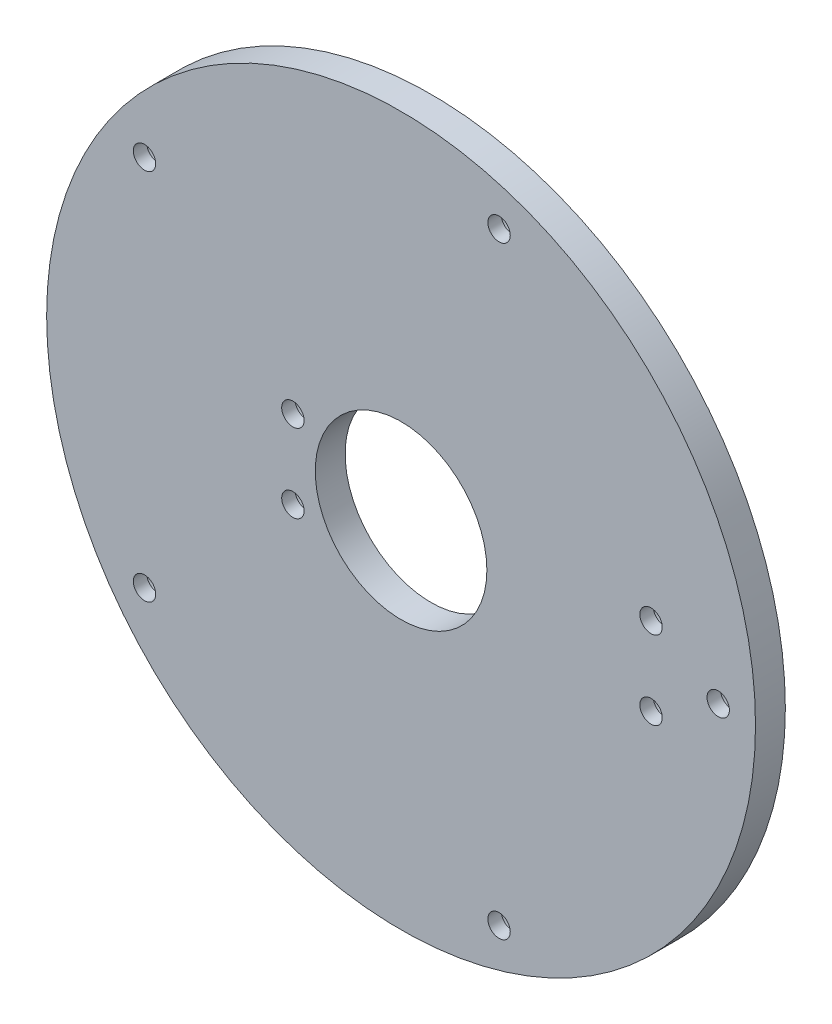
ISO-10303-21;
HEADER;
FILE_DESCRIPTION(('STEP AP214'),'2;1');
FILE_NAME('part.step','',(''),(''),'','','');
FILE_SCHEMA(('AUTOMOTIVE_DESIGN { 1 0 10303 214 1 1 1 1 }'));
ENDSEC;
DATA;
#1=APPLICATION_CONTEXT('core data for automotive mechanical design processes');
#2=APPLICATION_PROTOCOL_DEFINITION('international standard','automotive_design',2000,#1);
#3=PRODUCT_CONTEXT('',#1,'mechanical');
#4=PRODUCT('Part','Part','',(#3));
#5=PRODUCT_RELATED_PRODUCT_CATEGORY('part','',(#4));
#6=PRODUCT_DEFINITION_FORMATION('','',#4);
#7=PRODUCT_DEFINITION_CONTEXT('part definition',#1,'design');
#8=PRODUCT_DEFINITION('design','',#6,#7);
#9=PRODUCT_DEFINITION_SHAPE('','',#8);
#10=(LENGTH_UNIT() NAMED_UNIT(*) SI_UNIT(.MILLI.,.METRE.));
#11=(NAMED_UNIT(*) PLANE_ANGLE_UNIT() SI_UNIT($,.RADIAN.));
#12=(NAMED_UNIT(*) SI_UNIT($,.STERADIAN.) SOLID_ANGLE_UNIT());
#13=UNCERTAINTY_MEASURE_WITH_UNIT(LENGTH_MEASURE(1.E-05),#10,'distance_accuracy_value','');
#14=(GEOMETRIC_REPRESENTATION_CONTEXT(3) GLOBAL_UNCERTAINTY_ASSIGNED_CONTEXT((#13)) GLOBAL_UNIT_ASSIGNED_CONTEXT((#10,
#11,#12)) REPRESENTATION_CONTEXT('',''));
#15=CARTESIAN_POINT('',(0.,0.,0.));
#16=DIRECTION('',(0.,0.,1.));
#17=DIRECTION('',(1.,0.,0.));
#18=AXIS2_PLACEMENT_3D('',#15,#16,#17);
#19=CARTESIAN_POINT('',(47.5,-57.1414213562373,0.));
#20=DIRECTION('',(0.,0.,1.));
#21=DIRECTION('',(1.,0.,0.));
#22=AXIS2_PLACEMENT_3D('',#19,#20,#21);
#23=PLANE('',#22);
#24=CARTESIAN_POINT('',(81.0000000000001,42.125,0.));
#25=DIRECTION('',(0.,0.,1.));
#26=DIRECTION('',(1.,0.,0.));
#27=AXIS2_PLACEMENT_3D('',#24,#25,#26);
#28=CIRCLE('',#27,2.75);
#29=CARTESIAN_POINT('',(83.7500000000001,42.125,0.));
#30=VERTEX_POINT('',#29);
#31=EDGE_CURVE('E184',#30,#30,#28,.T.);
#32=ORIENTED_EDGE('',*,*,#31,.T.);
#33=EDGE_LOOP('',(#32));
#34=FACE_BOUND('',#33,.T.);
#35=CARTESIAN_POINT('',(81.0000000000001,52.625,0.));
#36=DIRECTION('',(0.,0.,1.));
#37=DIRECTION('',(1.,0.,0.));
#38=AXIS2_PLACEMENT_3D('',#35,#36,#37);
#39=CIRCLE('',#38,2.75);
#40=CARTESIAN_POINT('',(83.7500000000001,52.625,0.));
#41=VERTEX_POINT('',#40);
#42=EDGE_CURVE('E195',#41,#41,#39,.T.);
#43=ORIENTED_EDGE('',*,*,#42,.T.);
#44=EDGE_LOOP('',(#43));
#45=FACE_BOUND('',#44,.T.);
#46=CARTESIAN_POINT('',(13.1167777390647,72.4808732224301,0.));
#47=DIRECTION('',(0.,0.,1.));
#48=DIRECTION('',(1.,0.,0.));
#49=AXIS2_PLACEMENT_3D('',#46,#47,#48);
#50=CIRCLE('',#49,2.75);
#51=CARTESIAN_POINT('',(15.8667777390647,72.4808732224301,0.));
#52=VERTEX_POINT('',#51);
#53=EDGE_CURVE('E211',#52,#52,#50,.T.);
#54=ORIENTED_EDGE('',*,*,#53,.T.);
#55=EDGE_LOOP('',(#54));
#56=FACE_BOUND('',#55,.T.);
#57=CARTESIAN_POINT('',(33.,42.125,0.));
#58=DIRECTION('',(0.,0.,1.));
#59=DIRECTION('',(1.,0.,0.));
#60=AXIS2_PLACEMENT_3D('',#57,#58,#59);
#61=CIRCLE('',#60,2.75);
#62=CARTESIAN_POINT('',(35.75,42.125,0.));
#63=VERTEX_POINT('',#62);
#64=EDGE_CURVE('E227',#63,#63,#61,.T.);
#65=ORIENTED_EDGE('',*,*,#64,.T.);
#66=EDGE_LOOP('',(#65));
#67=FACE_BOUND('',#66,.T.);
#68=CARTESIAN_POINT('',(47.5,47.5,0.));
#69=DIRECTION('',(0.,0.,1.));
#70=DIRECTION('',(1.,0.,0.));
#71=AXIS2_PLACEMENT_3D('',#68,#69,#70);
#72=CIRCLE('',#71,47.5);
#73=CARTESIAN_POINT('',(95.,47.5,0.));
#74=VERTEX_POINT('',#73);
#75=EDGE_CURVE('E36',#74,#74,#72,.T.);
#76=ORIENTED_EDGE('',*,*,#75,.F.);
#77=EDGE_LOOP('',(#76));
#78=FACE_BOUND('',#77,.T.);
#79=CARTESIAN_POINT('',(47.5,47.5,0.));
#80=DIRECTION('',(0.,0.,1.));
#81=DIRECTION('',(1.,0.,0.));
#82=AXIS2_PLACEMENT_3D('',#79,#80,#81);
#83=CIRCLE('',#82,11.5);
#84=CARTESIAN_POINT('',(59.,47.5,0.));
#85=VERTEX_POINT('',#84);
#86=EDGE_CURVE('E48',#85,#85,#83,.T.);
#87=ORIENTED_EDGE('',*,*,#86,.T.);
#88=EDGE_LOOP('',(#87));
#89=FACE_BOUND('',#88,.T.);
#90=CARTESIAN_POINT('',(33.,52.625,0.));
#91=DIRECTION('',(0.,0.,1.));
#92=DIRECTION('',(1.,0.,0.));
#93=AXIS2_PLACEMENT_3D('',#90,#91,#92);
#94=CIRCLE('',#93,2.75);
#95=CARTESIAN_POINT('',(35.75,52.625,0.));
#96=VERTEX_POINT('',#95);
#97=EDGE_CURVE('E61',#96,#96,#94,.T.);
#98=ORIENTED_EDGE('',*,*,#97,.T.);
#99=EDGE_LOOP('',(#98));
#100=FACE_BOUND('',#99,.T.);
#101=CARTESIAN_POINT('',(13.1167777390647,22.5191267775699,0.));
#102=DIRECTION('',(0.,0.,1.));
#103=DIRECTION('',(1.,0.,0.));
#104=AXIS2_PLACEMENT_3D('',#101,#102,#103);
#105=CIRCLE('',#104,2.75);
#106=CARTESIAN_POINT('',(15.8667777390647,22.5191267775699,0.));
#107=VERTEX_POINT('',#106);
#108=EDGE_CURVE('E160',#107,#107,#105,.T.);
#109=ORIENTED_EDGE('',*,*,#108,.T.);
#110=EDGE_LOOP('',(#109));
#111=FACE_BOUND('',#110,.T.);
#112=CARTESIAN_POINT('',(60.6332222609353,87.919901942544,0.));
#113=DIRECTION('',(0.,0.,1.));
#114=DIRECTION('',(1.,0.,0.));
#115=AXIS2_PLACEMENT_3D('',#112,#113,#114);
#116=CIRCLE('',#115,2.75);
#117=CARTESIAN_POINT('',(63.3832222609353,87.919901942544,0.));
#118=VERTEX_POINT('',#117);
#119=EDGE_CURVE('E164',#118,#118,#116,.T.);
#120=ORIENTED_EDGE('',*,*,#119,.T.);
#121=EDGE_LOOP('',(#120));
#122=FACE_BOUND('',#121,.T.);
#123=CARTESIAN_POINT('',(90.,47.5,0.));
#124=DIRECTION('',(0.,0.,1.));
#125=DIRECTION('',(1.,0.,0.));
#126=AXIS2_PLACEMENT_3D('',#123,#124,#125);
#127=CIRCLE('',#126,2.75);
#128=CARTESIAN_POINT('',(92.75,47.5,0.));
#129=VERTEX_POINT('',#128);
#130=EDGE_CURVE('E168',#129,#129,#127,.T.);
#131=ORIENTED_EDGE('',*,*,#130,.T.);
#132=EDGE_LOOP('',(#131));
#133=FACE_BOUND('',#132,.T.);
#134=CARTESIAN_POINT('',(60.6332222609353,7.08009805745598,0.));
#135=DIRECTION('',(0.,0.,1.));
#136=DIRECTION('',(1.,0.,0.));
#137=AXIS2_PLACEMENT_3D('',#134,#135,#136);
#138=CIRCLE('',#137,2.75);
#139=CARTESIAN_POINT('',(63.3832222609353,7.08009805745598,0.));
#140=VERTEX_POINT('',#139);
#141=EDGE_CURVE('E171',#140,#140,#138,.T.);
#142=ORIENTED_EDGE('',*,*,#141,.T.);
#143=EDGE_LOOP('',(#142));
#144=FACE_BOUND('',#143,.T.);
#145=ADVANCED_FACE('F32',(#34,#45,#56,#67,#78,#89,#100,#111,#122,#133,#144),#23,.F.);
#146=CARTESIAN_POINT('',(90.,47.5,4.));
#147=DIRECTION('',(0.,0.,-1.));
#148=DIRECTION('',(-1.,0.,0.));
#149=AXIS2_PLACEMENT_3D('',#146,#147,#148);
#150=CYLINDRICAL_SURFACE('',#149,1.5);
#151=CARTESIAN_POINT('',(90.,47.5,2.2));
#152=DIRECTION('',(0.,0.,1.));
#153=DIRECTION('',(1.,0.,0.));
#154=AXIS2_PLACEMENT_3D('',#151,#152,#153);
#155=CIRCLE('',#154,1.5);
#156=CARTESIAN_POINT('',(91.5,47.5,2.2));
#157=VERTEX_POINT('',#156);
#158=EDGE_CURVE('E189',#157,#157,#155,.T.);
#159=ORIENTED_EDGE('',*,*,#158,.F.);
#160=EDGE_LOOP('',(#159));
#161=FACE_BOUND('',#160,.T.);
#162=CARTESIAN_POINT('',(90.,47.5,4.));
#163=DIRECTION('',(0.,0.,1.));
#164=DIRECTION('',(1.,0.,0.));
#165=AXIS2_PLACEMENT_3D('',#162,#163,#164);
#166=CIRCLE('',#165,1.5);
#167=CARTESIAN_POINT('',(91.5,47.5,4.));
#168=VERTEX_POINT('',#167);
#169=EDGE_CURVE('E40',#168,#168,#166,.T.);
#170=ORIENTED_EDGE('',*,*,#169,.T.);
#171=EDGE_LOOP('',(#170));
#172=FACE_BOUND('',#171,.T.);
#173=ADVANCED_FACE('F105',(#161,#172),#150,.F.);
#174=CARTESIAN_POINT('',(81.0000000000001,52.625,4.));
#175=DIRECTION('',(0.,0.,-1.));
#176=DIRECTION('',(-1.,0.,0.));
#177=AXIS2_PLACEMENT_3D('',#174,#175,#176);
#178=CYLINDRICAL_SURFACE('',#177,1.5);
#179=CARTESIAN_POINT('',(81.0000000000001,52.625,2.2));
#180=DIRECTION('',(0.,0.,1.));
#181=DIRECTION('',(1.,0.,0.));
#182=AXIS2_PLACEMENT_3D('',#179,#180,#181);
#183=CIRCLE('',#182,1.5);
#184=CARTESIAN_POINT('',(82.5000000000001,52.625,2.2));
#185=VERTEX_POINT('',#184);
#186=EDGE_CURVE('E197',#185,#185,#183,.T.);
#187=ORIENTED_EDGE('',*,*,#186,.F.);
#188=EDGE_LOOP('',(#187));
#189=FACE_BOUND('',#188,.T.);
#190=CARTESIAN_POINT('',(81.0000000000001,52.625,4.));
#191=DIRECTION('',(0.,0.,1.));
#192=DIRECTION('',(1.,0.,0.));
#193=AXIS2_PLACEMENT_3D('',#190,#191,#192);
#194=CIRCLE('',#193,1.5);
#195=CARTESIAN_POINT('',(82.5000000000001,52.625,4.));
#196=VERTEX_POINT('',#195);
#197=EDGE_CURVE('E45',#196,#196,#194,.T.);
#198=ORIENTED_EDGE('',*,*,#197,.T.);
#199=EDGE_LOOP('',(#198));
#200=FACE_BOUND('',#199,.T.);
#201=ADVANCED_FACE('F93',(#189,#200),#178,.F.);
#202=CARTESIAN_POINT('',(60.6332222609353,87.919901942544,4.));
#203=DIRECTION('',(0.,0.,-1.));
#204=DIRECTION('',(-1.,0.,0.));
#205=AXIS2_PLACEMENT_3D('',#202,#203,#204);
#206=CYLINDRICAL_SURFACE('',#205,1.5);
#207=CARTESIAN_POINT('',(60.6332222609353,87.919901942544,2.2));
#208=DIRECTION('',(0.,0.,1.));
#209=DIRECTION('',(1.,0.,0.));
#210=AXIS2_PLACEMENT_3D('',#207,#208,#209);
#211=CIRCLE('',#210,1.5);
#212=CARTESIAN_POINT('',(62.1332222609353,87.919901942544,2.2));
#213=VERTEX_POINT('',#212);
#214=EDGE_CURVE('E205',#213,#213,#211,.T.);
#215=ORIENTED_EDGE('',*,*,#214,.F.);
#216=EDGE_LOOP('',(#215));
#217=FACE_BOUND('',#216,.T.);
#218=CARTESIAN_POINT('',(60.6332222609353,87.919901942544,4.));
#219=DIRECTION('',(0.,0.,1.));
#220=DIRECTION('',(1.,0.,0.));
#221=AXIS2_PLACEMENT_3D('',#218,#219,#220);
#222=CIRCLE('',#221,1.5);
#223=CARTESIAN_POINT('',(62.1332222609353,87.919901942544,4.));
#224=VERTEX_POINT('',#223);
#225=EDGE_CURVE('E88',#224,#224,#222,.T.);
#226=ORIENTED_EDGE('',*,*,#225,.T.);
#227=EDGE_LOOP('',(#226));
#228=FACE_BOUND('',#227,.T.);
#229=ADVANCED_FACE('F113',(#217,#228),#206,.F.);
#230=CARTESIAN_POINT('',(13.1167777390647,72.4808732224301,4.));
#231=DIRECTION('',(0.,0.,-1.));
#232=DIRECTION('',(-1.,0.,0.));
#233=AXIS2_PLACEMENT_3D('',#230,#231,#232);
#234=CYLINDRICAL_SURFACE('',#233,1.5);
#235=CARTESIAN_POINT('',(13.1167777390647,72.4808732224301,2.2));
#236=DIRECTION('',(0.,0.,1.));
#237=DIRECTION('',(1.,0.,0.));
#238=AXIS2_PLACEMENT_3D('',#235,#236,#237);
#239=CIRCLE('',#238,1.5);
#240=CARTESIAN_POINT('',(14.6167777390647,72.4808732224301,2.2));
#241=VERTEX_POINT('',#240);
#242=EDGE_CURVE('E213',#241,#241,#239,.T.);
#243=ORIENTED_EDGE('',*,*,#242,.F.);
#244=EDGE_LOOP('',(#243));
#245=FACE_BOUND('',#244,.T.);
#246=CARTESIAN_POINT('',(13.1167777390647,72.4808732224301,4.));
#247=DIRECTION('',(0.,0.,1.));
#248=DIRECTION('',(1.,0.,0.));
#249=AXIS2_PLACEMENT_3D('',#246,#247,#248);
#250=CIRCLE('',#249,1.5);
#251=CARTESIAN_POINT('',(14.6167777390647,72.4808732224301,4.));
#252=VERTEX_POINT('',#251);
#253=EDGE_CURVE('E85',#252,#252,#250,.T.);
#254=ORIENTED_EDGE('',*,*,#253,.T.);
#255=EDGE_LOOP('',(#254));
#256=FACE_BOUND('',#255,.T.);
#257=ADVANCED_FACE('F123',(#245,#256),#234,.F.);
#258=CARTESIAN_POINT('',(33.,52.625,4.));
#259=DIRECTION('',(0.,0.,-1.));
#260=DIRECTION('',(-1.,0.,0.));
#261=AXIS2_PLACEMENT_3D('',#258,#259,#260);
#262=CYLINDRICAL_SURFACE('',#261,1.5);
#263=CARTESIAN_POINT('',(33.,52.625,2.2));
#264=DIRECTION('',(0.,0.,1.));
#265=DIRECTION('',(1.,0.,0.));
#266=AXIS2_PLACEMENT_3D('',#263,#264,#265);
#267=CIRCLE('',#266,1.5);
#268=CARTESIAN_POINT('',(34.5,52.625,2.2));
#269=VERTEX_POINT('',#268);
#270=EDGE_CURVE('E56',#269,#269,#267,.T.);
#271=ORIENTED_EDGE('',*,*,#270,.F.);
#272=EDGE_LOOP('',(#271));
#273=FACE_BOUND('',#272,.T.);
#274=CARTESIAN_POINT('',(33.,52.625,4.));
#275=DIRECTION('',(0.,0.,1.));
#276=DIRECTION('',(1.,0.,0.));
#277=AXIS2_PLACEMENT_3D('',#274,#275,#276);
#278=CIRCLE('',#277,1.5);
#279=CARTESIAN_POINT('',(34.5,52.625,4.));
#280=VERTEX_POINT('',#279);
#281=EDGE_CURVE('E82',#280,#280,#278,.T.);
#282=ORIENTED_EDGE('',*,*,#281,.T.);
#283=EDGE_LOOP('',(#282));
#284=FACE_BOUND('',#283,.T.);
#285=ADVANCED_FACE('F127',(#273,#284),#262,.F.);
#286=CARTESIAN_POINT('',(33.,42.125,4.));
#287=DIRECTION('',(0.,0.,-1.));
#288=DIRECTION('',(-1.,0.,0.));
#289=AXIS2_PLACEMENT_3D('',#286,#287,#288);
#290=CYLINDRICAL_SURFACE('',#289,1.5);
#291=CARTESIAN_POINT('',(33.,42.125,2.2));
#292=DIRECTION('',(0.,0.,1.));
#293=DIRECTION('',(1.,0.,0.));
#294=AXIS2_PLACEMENT_3D('',#291,#292,#293);
#295=CIRCLE('',#294,1.5);
#296=CARTESIAN_POINT('',(34.5,42.125,2.2));
#297=VERTEX_POINT('',#296);
#298=EDGE_CURVE('E229',#297,#297,#295,.T.);
#299=ORIENTED_EDGE('',*,*,#298,.F.);
#300=EDGE_LOOP('',(#299));
#301=FACE_BOUND('',#300,.T.);
#302=CARTESIAN_POINT('',(33.,42.125,4.));
#303=DIRECTION('',(0.,0.,1.));
#304=DIRECTION('',(1.,0.,0.));
#305=AXIS2_PLACEMENT_3D('',#302,#303,#304);
#306=CIRCLE('',#305,1.5);
#307=CARTESIAN_POINT('',(34.5,42.125,4.));
#308=VERTEX_POINT('',#307);
#309=EDGE_CURVE('E79',#308,#308,#306,.T.);
#310=ORIENTED_EDGE('',*,*,#309,.T.);
#311=EDGE_LOOP('',(#310));
#312=FACE_BOUND('',#311,.T.);
#313=ADVANCED_FACE('F131',(#301,#312),#290,.F.);
#314=CARTESIAN_POINT('',(60.6332222609353,7.08009805745598,4.));
#315=DIRECTION('',(0.,0.,-1.));
#316=DIRECTION('',(-1.,0.,0.));
#317=AXIS2_PLACEMENT_3D('',#314,#315,#316);
#318=CYLINDRICAL_SURFACE('',#317,1.5);
#319=CARTESIAN_POINT('',(60.6332222609353,7.08009805745598,2.2));
#320=DIRECTION('',(0.,0.,1.));
#321=DIRECTION('',(1.,0.,0.));
#322=AXIS2_PLACEMENT_3D('',#319,#320,#321);
#323=CIRCLE('',#322,1.5);
#324=CARTESIAN_POINT('',(62.1332222609353,7.08009805745598,2.2));
#325=VERTEX_POINT('',#324);
#326=EDGE_CURVE('E173',#325,#325,#323,.T.);
#327=ORIENTED_EDGE('',*,*,#326,.F.);
#328=EDGE_LOOP('',(#327));
#329=FACE_BOUND('',#328,.T.);
#330=CARTESIAN_POINT('',(60.6332222609353,7.08009805745598,4.));
#331=DIRECTION('',(0.,0.,1.));
#332=DIRECTION('',(1.,0.,0.));
#333=AXIS2_PLACEMENT_3D('',#330,#331,#332);
#334=CIRCLE('',#333,1.5);
#335=CARTESIAN_POINT('',(62.1332222609353,7.08009805745598,4.));
#336=VERTEX_POINT('',#335);
#337=EDGE_CURVE('E76',#336,#336,#334,.T.);
#338=ORIENTED_EDGE('',*,*,#337,.T.);
#339=EDGE_LOOP('',(#338));
#340=FACE_BOUND('',#339,.T.);
#341=ADVANCED_FACE('F135',(#329,#340),#318,.F.);
#342=CARTESIAN_POINT('',(13.1167777390647,22.5191267775699,4.));
#343=DIRECTION('',(0.,0.,-1.));
#344=DIRECTION('',(-1.,0.,0.));
#345=AXIS2_PLACEMENT_3D('',#342,#343,#344);
#346=CYLINDRICAL_SURFACE('',#345,1.5);
#347=CARTESIAN_POINT('',(13.1167777390647,22.5191267775699,2.2));
#348=DIRECTION('',(0.,0.,1.));
#349=DIRECTION('',(1.,0.,0.));
#350=AXIS2_PLACEMENT_3D('',#347,#348,#349);
#351=CIRCLE('',#350,1.5);
#352=CARTESIAN_POINT('',(14.6167777390647,22.5191267775699,2.2));
#353=VERTEX_POINT('',#352);
#354=EDGE_CURVE('E221',#353,#353,#351,.T.);
#355=ORIENTED_EDGE('',*,*,#354,.F.);
#356=EDGE_LOOP('',(#355));
#357=FACE_BOUND('',#356,.T.);
#358=CARTESIAN_POINT('',(13.1167777390647,22.5191267775699,4.));
#359=DIRECTION('',(0.,0.,1.));
#360=DIRECTION('',(1.,0.,0.));
#361=AXIS2_PLACEMENT_3D('',#358,#359,#360);
#362=CIRCLE('',#361,1.5);
#363=CARTESIAN_POINT('',(14.6167777390647,22.5191267775699,4.));
#364=VERTEX_POINT('',#363);
#365=EDGE_CURVE('E73',#364,#364,#362,.T.);
#366=ORIENTED_EDGE('',*,*,#365,.T.);
#367=EDGE_LOOP('',(#366));
#368=FACE_BOUND('',#367,.T.);
#369=ADVANCED_FACE('F139',(#357,#368),#346,.F.);
#370=CARTESIAN_POINT('',(47.5,47.5,4.));
#371=DIRECTION('',(0.,0.,-1.));
#372=DIRECTION('',(-1.,0.,0.));
#373=AXIS2_PLACEMENT_3D('',#370,#371,#372);
#374=CYLINDRICAL_SURFACE('',#373,47.5);
#375=CARTESIAN_POINT('',(47.5,47.5,4.));
#376=DIRECTION('',(0.,0.,1.));
#377=DIRECTION('',(1.,0.,0.));
#378=AXIS2_PLACEMENT_3D('',#375,#376,#377);
#379=CIRCLE('',#378,47.5);
#380=CARTESIAN_POINT('',(95.,47.5,4.));
#381=VERTEX_POINT('',#380);
#382=EDGE_CURVE('E70',#381,#381,#379,.T.);
#383=ORIENTED_EDGE('',*,*,#382,.F.);
#384=EDGE_LOOP('',(#383));
#385=FACE_BOUND('',#384,.T.);
#386=ORIENTED_EDGE('',*,*,#75,.T.);
#387=EDGE_LOOP('',(#386));
#388=FACE_BOUND('',#387,.T.);
#389=ADVANCED_FACE('F142',(#385,#388),#374,.T.);
#390=CARTESIAN_POINT('',(47.5,47.5,4.));
#391=DIRECTION('',(0.,0.,-1.));
#392=DIRECTION('',(-1.,0.,0.));
#393=AXIS2_PLACEMENT_3D('',#390,#391,#392);
#394=CYLINDRICAL_SURFACE('',#393,11.5);
#395=CARTESIAN_POINT('',(47.5,47.5,4.));
#396=DIRECTION('',(0.,0.,1.));
#397=DIRECTION('',(1.,0.,0.));
#398=AXIS2_PLACEMENT_3D('',#395,#396,#397);
#399=CIRCLE('',#398,11.5);
#400=CARTESIAN_POINT('',(59.,47.5,4.));
#401=VERTEX_POINT('',#400);
#402=EDGE_CURVE('E54',#401,#401,#399,.T.);
#403=ORIENTED_EDGE('',*,*,#402,.T.);
#404=EDGE_LOOP('',(#403));
#405=FACE_BOUND('',#404,.T.);
#406=ORIENTED_EDGE('',*,*,#86,.F.);
#407=EDGE_LOOP('',(#406));
#408=FACE_BOUND('',#407,.T.);
#409=ADVANCED_FACE('F34',(#405,#408),#394,.F.);
#410=CARTESIAN_POINT('',(81.0000000000001,42.125,4.));
#411=DIRECTION('',(0.,0.,-1.));
#412=DIRECTION('',(-1.,0.,0.));
#413=AXIS2_PLACEMENT_3D('',#410,#411,#412);
#414=CYLINDRICAL_SURFACE('',#413,1.5);
#415=CARTESIAN_POINT('',(81.0000000000001,42.125,2.2));
#416=DIRECTION('',(0.,0.,1.));
#417=DIRECTION('',(1.,0.,0.));
#418=AXIS2_PLACEMENT_3D('',#415,#416,#417);
#419=CIRCLE('',#418,1.5);
#420=CARTESIAN_POINT('',(82.5000000000001,42.125,2.2));
#421=VERTEX_POINT('',#420);
#422=EDGE_CURVE('E180',#421,#421,#419,.T.);
#423=ORIENTED_EDGE('',*,*,#422,.F.);
#424=EDGE_LOOP('',(#423));
#425=FACE_BOUND('',#424,.T.);
#426=CARTESIAN_POINT('',(81.0000000000001,42.125,4.));
#427=DIRECTION('',(0.,0.,1.));
#428=DIRECTION('',(1.,0.,0.));
#429=AXIS2_PLACEMENT_3D('',#426,#427,#428);
#430=CIRCLE('',#429,1.5);
#431=CARTESIAN_POINT('',(82.5000000000001,42.125,4.));
#432=VERTEX_POINT('',#431);
#433=EDGE_CURVE('E10',#432,#432,#430,.T.);
#434=ORIENTED_EDGE('',*,*,#433,.T.);
#435=EDGE_LOOP('',(#434));
#436=FACE_BOUND('',#435,.T.);
#437=ADVANCED_FACE('F99',(#425,#436),#414,.F.);
#438=CARTESIAN_POINT('',(47.5,-57.1414213562373,4.));
#439=DIRECTION('',(0.,0.,1.));
#440=DIRECTION('',(1.,0.,0.));
#441=AXIS2_PLACEMENT_3D('',#438,#439,#440);
#442=PLANE('',#441);
#443=ORIENTED_EDGE('',*,*,#402,.F.);
#444=EDGE_LOOP('',(#443));
#445=FACE_BOUND('',#444,.T.);
#446=ORIENTED_EDGE('',*,*,#382,.T.);
#447=EDGE_LOOP('',(#446));
#448=FACE_BOUND('',#447,.T.);
#449=ORIENTED_EDGE('',*,*,#365,.F.);
#450=EDGE_LOOP('',(#449));
#451=FACE_BOUND('',#450,.T.);
#452=ORIENTED_EDGE('',*,*,#337,.F.);
#453=EDGE_LOOP('',(#452));
#454=FACE_BOUND('',#453,.T.);
#455=ORIENTED_EDGE('',*,*,#309,.F.);
#456=EDGE_LOOP('',(#455));
#457=FACE_BOUND('',#456,.T.);
#458=ORIENTED_EDGE('',*,*,#281,.F.);
#459=EDGE_LOOP('',(#458));
#460=FACE_BOUND('',#459,.T.);
#461=ORIENTED_EDGE('',*,*,#253,.F.);
#462=EDGE_LOOP('',(#461));
#463=FACE_BOUND('',#462,.T.);
#464=ORIENTED_EDGE('',*,*,#225,.F.);
#465=EDGE_LOOP('',(#464));
#466=FACE_BOUND('',#465,.T.);
#467=ORIENTED_EDGE('',*,*,#197,.F.);
#468=EDGE_LOOP('',(#467));
#469=FACE_BOUND('',#468,.T.);
#470=ORIENTED_EDGE('',*,*,#169,.F.);
#471=EDGE_LOOP('',(#470));
#472=FACE_BOUND('',#471,.T.);
#473=ORIENTED_EDGE('',*,*,#433,.F.);
#474=EDGE_LOOP('',(#473));
#475=FACE_BOUND('',#474,.T.);
#476=ADVANCED_FACE('F95',(#445,#448,#451,#454,#457,#460,#463,#466,#469,#472,#475),#442,.T.);
#477=CARTESIAN_POINT('',(33.,52.625,2.2));
#478=DIRECTION('',(0.,0.,-1.));
#479=DIRECTION('',(-1.,0.,0.));
#480=AXIS2_PLACEMENT_3D('',#477,#478,#479);
#481=CYLINDRICAL_SURFACE('',#480,2.75);
#482=CARTESIAN_POINT('',(33.,52.625,2.2));
#483=DIRECTION('',(0.,0.,1.));
#484=DIRECTION('',(1.,0.,0.));
#485=AXIS2_PLACEMENT_3D('',#482,#483,#484);
#486=CIRCLE('',#485,2.75);
#487=CARTESIAN_POINT('',(35.75,52.625,2.2));
#488=VERTEX_POINT('',#487);
#489=EDGE_CURVE('E50',#488,#488,#486,.T.);
#490=ORIENTED_EDGE('',*,*,#489,.T.);
#491=EDGE_LOOP('',(#490));
#492=FACE_BOUND('',#491,.T.);
#493=ORIENTED_EDGE('',*,*,#97,.F.);
#494=EDGE_LOOP('',(#493));
#495=FACE_BOUND('',#494,.T.);
#496=ADVANCED_FACE('F98',(#492,#495),#481,.F.);
#497=CARTESIAN_POINT('',(47.5,-57.1414213562373,2.2));
#498=DIRECTION('',(0.,0.,1.));
#499=DIRECTION('',(1.,0.,0.));
#500=AXIS2_PLACEMENT_3D('',#497,#498,#499);
#501=PLANE('',#500);
#502=ORIENTED_EDGE('',*,*,#270,.T.);
#503=EDGE_LOOP('',(#502));
#504=FACE_BOUND('',#503,.T.);
#505=ORIENTED_EDGE('',*,*,#489,.F.);
#506=EDGE_LOOP('',(#505));
#507=FACE_BOUND('',#506,.T.);
#508=ADVANCED_FACE('F240',(#504,#507),#501,.F.);
#509=CARTESIAN_POINT('',(33.,42.125,2.2));
#510=DIRECTION('',(0.,0.,-1.));
#511=DIRECTION('',(-1.,0.,0.));
#512=AXIS2_PLACEMENT_3D('',#509,#510,#511);
#513=CYLINDRICAL_SURFACE('',#512,2.75);
#514=CARTESIAN_POINT('',(33.,42.125,2.2));
#515=DIRECTION('',(0.,0.,1.));
#516=DIRECTION('',(1.,0.,0.));
#517=AXIS2_PLACEMENT_3D('',#514,#515,#516);
#518=CIRCLE('',#517,2.75);
#519=CARTESIAN_POINT('',(35.75,42.125,2.2));
#520=VERTEX_POINT('',#519);
#521=EDGE_CURVE('E67',#520,#520,#518,.T.);
#522=ORIENTED_EDGE('',*,*,#521,.T.);
#523=EDGE_LOOP('',(#522));
#524=FACE_BOUND('',#523,.T.);
#525=ORIENTED_EDGE('',*,*,#64,.F.);
#526=EDGE_LOOP('',(#525));
#527=FACE_BOUND('',#526,.T.);
#528=ADVANCED_FACE('F237',(#524,#527),#513,.F.);
#529=CARTESIAN_POINT('',(47.5,-57.1414213562373,2.2));
#530=DIRECTION('',(0.,0.,1.));
#531=DIRECTION('',(1.,0.,0.));
#532=AXIS2_PLACEMENT_3D('',#529,#530,#531);
#533=PLANE('',#532);
#534=ORIENTED_EDGE('',*,*,#298,.T.);
#535=EDGE_LOOP('',(#534));
#536=FACE_BOUND('',#535,.T.);
#537=ORIENTED_EDGE('',*,*,#521,.F.);
#538=EDGE_LOOP('',(#537));
#539=FACE_BOUND('',#538,.T.);
#540=ADVANCED_FACE('F239',(#536,#539),#533,.F.);
#541=CARTESIAN_POINT('',(13.1167777390647,22.5191267775699,2.2));
#542=DIRECTION('',(0.,0.,-1.));
#543=DIRECTION('',(-1.,0.,0.));
#544=AXIS2_PLACEMENT_3D('',#541,#542,#543);
#545=CYLINDRICAL_SURFACE('',#544,2.75);
#546=CARTESIAN_POINT('',(13.1167777390647,22.5191267775699,2.2));
#547=DIRECTION('',(0.,0.,1.));
#548=DIRECTION('',(1.,0.,0.));
#549=AXIS2_PLACEMENT_3D('',#546,#547,#548);
#550=CIRCLE('',#549,2.75);
#551=CARTESIAN_POINT('',(15.8667777390647,22.5191267775699,2.2));
#552=VERTEX_POINT('',#551);
#553=EDGE_CURVE('E224',#552,#552,#550,.T.);
#554=ORIENTED_EDGE('',*,*,#553,.T.);
#555=EDGE_LOOP('',(#554));
#556=FACE_BOUND('',#555,.T.);
#557=ORIENTED_EDGE('',*,*,#108,.F.);
#558=EDGE_LOOP('',(#557));
#559=FACE_BOUND('',#558,.T.);
#560=ADVANCED_FACE('F247',(#556,#559),#545,.F.);
#561=CARTESIAN_POINT('',(47.5,-57.1414213562373,2.2));
#562=DIRECTION('',(0.,0.,1.));
#563=DIRECTION('',(1.,0.,0.));
#564=AXIS2_PLACEMENT_3D('',#561,#562,#563);
#565=PLANE('',#564);
#566=ORIENTED_EDGE('',*,*,#354,.T.);
#567=EDGE_LOOP('',(#566));
#568=FACE_BOUND('',#567,.T.);
#569=ORIENTED_EDGE('',*,*,#553,.F.);
#570=EDGE_LOOP('',(#569));
#571=FACE_BOUND('',#570,.T.);
#572=ADVANCED_FACE('F285',(#568,#571),#565,.F.);
#573=CARTESIAN_POINT('',(13.1167777390647,72.4808732224301,2.2));
#574=DIRECTION('',(0.,0.,-1.));
#575=DIRECTION('',(-1.,0.,0.));
#576=AXIS2_PLACEMENT_3D('',#573,#574,#575);
#577=CYLINDRICAL_SURFACE('',#576,2.75);
#578=CARTESIAN_POINT('',(13.1167777390647,72.4808732224301,2.2));
#579=DIRECTION('',(0.,0.,1.));
#580=DIRECTION('',(1.,0.,0.));
#581=AXIS2_PLACEMENT_3D('',#578,#579,#580);
#582=CIRCLE('',#581,2.75);
#583=CARTESIAN_POINT('',(15.8667777390647,72.4808732224301,2.2));
#584=VERTEX_POINT('',#583);
#585=EDGE_CURVE('E216',#584,#584,#582,.T.);
#586=ORIENTED_EDGE('',*,*,#585,.T.);
#587=EDGE_LOOP('',(#586));
#588=FACE_BOUND('',#587,.T.);
#589=ORIENTED_EDGE('',*,*,#53,.F.);
#590=EDGE_LOOP('',(#589));
#591=FACE_BOUND('',#590,.T.);
#592=ADVANCED_FACE('F294',(#588,#591),#577,.F.);
#593=CARTESIAN_POINT('',(47.5,-57.1414213562373,2.2));
#594=DIRECTION('',(0.,0.,1.));
#595=DIRECTION('',(1.,0.,0.));
#596=AXIS2_PLACEMENT_3D('',#593,#594,#595);
#597=PLANE('',#596);
#598=ORIENTED_EDGE('',*,*,#242,.T.);
#599=EDGE_LOOP('',(#598));
#600=FACE_BOUND('',#599,.T.);
#601=ORIENTED_EDGE('',*,*,#585,.F.);
#602=EDGE_LOOP('',(#601));
#603=FACE_BOUND('',#602,.T.);
#604=ADVANCED_FACE('F304',(#600,#603),#597,.F.);
#605=CARTESIAN_POINT('',(60.6332222609353,87.919901942544,2.2));
#606=DIRECTION('',(0.,0.,-1.));
#607=DIRECTION('',(-1.,0.,0.));
#608=AXIS2_PLACEMENT_3D('',#605,#606,#607);
#609=CYLINDRICAL_SURFACE('',#608,2.75);
#610=CARTESIAN_POINT('',(60.6332222609353,87.919901942544,2.2));
#611=DIRECTION('',(0.,0.,1.));
#612=DIRECTION('',(1.,0.,0.));
#613=AXIS2_PLACEMENT_3D('',#610,#611,#612);
#614=CIRCLE('',#613,2.75);
#615=CARTESIAN_POINT('',(63.3832222609353,87.919901942544,2.2));
#616=VERTEX_POINT('',#615);
#617=EDGE_CURVE('E208',#616,#616,#614,.T.);
#618=ORIENTED_EDGE('',*,*,#617,.T.);
#619=EDGE_LOOP('',(#618));
#620=FACE_BOUND('',#619,.T.);
#621=ORIENTED_EDGE('',*,*,#119,.F.);
#622=EDGE_LOOP('',(#621));
#623=FACE_BOUND('',#622,.T.);
#624=ADVANCED_FACE('F314',(#620,#623),#609,.F.);
#625=CARTESIAN_POINT('',(47.5,-57.1414213562373,2.2));
#626=DIRECTION('',(0.,0.,1.));
#627=DIRECTION('',(1.,0.,0.));
#628=AXIS2_PLACEMENT_3D('',#625,#626,#627);
#629=PLANE('',#628);
#630=ORIENTED_EDGE('',*,*,#214,.T.);
#631=EDGE_LOOP('',(#630));
#632=FACE_BOUND('',#631,.T.);
#633=ORIENTED_EDGE('',*,*,#617,.F.);
#634=EDGE_LOOP('',(#633));
#635=FACE_BOUND('',#634,.T.);
#636=ADVANCED_FACE('F324',(#632,#635),#629,.F.);
#637=CARTESIAN_POINT('',(81.0000000000001,52.625,2.2));
#638=DIRECTION('',(0.,0.,-1.));
#639=DIRECTION('',(-1.,0.,0.));
#640=AXIS2_PLACEMENT_3D('',#637,#638,#639);
#641=CYLINDRICAL_SURFACE('',#640,2.75);
#642=CARTESIAN_POINT('',(81.0000000000001,52.625,2.2));
#643=DIRECTION('',(0.,0.,1.));
#644=DIRECTION('',(1.,0.,0.));
#645=AXIS2_PLACEMENT_3D('',#642,#643,#644);
#646=CIRCLE('',#645,2.75);
#647=CARTESIAN_POINT('',(83.7500000000001,52.625,2.2));
#648=VERTEX_POINT('',#647);
#649=EDGE_CURVE('E200',#648,#648,#646,.T.);
#650=ORIENTED_EDGE('',*,*,#649,.T.);
#651=EDGE_LOOP('',(#650));
#652=FACE_BOUND('',#651,.T.);
#653=ORIENTED_EDGE('',*,*,#42,.F.);
#654=EDGE_LOOP('',(#653));
#655=FACE_BOUND('',#654,.T.);
#656=ADVANCED_FACE('F334',(#652,#655),#641,.F.);
#657=CARTESIAN_POINT('',(47.5,-57.1414213562373,2.2));
#658=DIRECTION('',(0.,0.,1.));
#659=DIRECTION('',(1.,0.,0.));
#660=AXIS2_PLACEMENT_3D('',#657,#658,#659);
#661=PLANE('',#660);
#662=ORIENTED_EDGE('',*,*,#186,.T.);
#663=EDGE_LOOP('',(#662));
#664=FACE_BOUND('',#663,.T.);
#665=ORIENTED_EDGE('',*,*,#649,.F.);
#666=EDGE_LOOP('',(#665));
#667=FACE_BOUND('',#666,.T.);
#668=ADVANCED_FACE('F344',(#664,#667),#661,.F.);
#669=CARTESIAN_POINT('',(90.,47.5,2.2));
#670=DIRECTION('',(0.,0.,-1.));
#671=DIRECTION('',(-1.,0.,0.));
#672=AXIS2_PLACEMENT_3D('',#669,#670,#671);
#673=CYLINDRICAL_SURFACE('',#672,2.75);
#674=CARTESIAN_POINT('',(90.,47.5,2.2));
#675=DIRECTION('',(0.,0.,1.));
#676=DIRECTION('',(1.,0.,0.));
#677=AXIS2_PLACEMENT_3D('',#674,#675,#676);
#678=CIRCLE('',#677,2.75);
#679=CARTESIAN_POINT('',(92.75,47.5,2.2));
#680=VERTEX_POINT('',#679);
#681=EDGE_CURVE('E192',#680,#680,#678,.T.);
#682=ORIENTED_EDGE('',*,*,#681,.T.);
#683=EDGE_LOOP('',(#682));
#684=FACE_BOUND('',#683,.T.);
#685=ORIENTED_EDGE('',*,*,#130,.F.);
#686=EDGE_LOOP('',(#685));
#687=FACE_BOUND('',#686,.T.);
#688=ADVANCED_FACE('F354',(#684,#687),#673,.F.);
#689=CARTESIAN_POINT('',(47.5,-57.1414213562373,2.2));
#690=DIRECTION('',(0.,0.,1.));
#691=DIRECTION('',(1.,0.,0.));
#692=AXIS2_PLACEMENT_3D('',#689,#690,#691);
#693=PLANE('',#692);
#694=ORIENTED_EDGE('',*,*,#158,.T.);
#695=EDGE_LOOP('',(#694));
#696=FACE_BOUND('',#695,.T.);
#697=ORIENTED_EDGE('',*,*,#681,.F.);
#698=EDGE_LOOP('',(#697));
#699=FACE_BOUND('',#698,.T.);
#700=ADVANCED_FACE('F364',(#696,#699),#693,.F.);
#701=CARTESIAN_POINT('',(81.0000000000001,42.125,2.2));
#702=DIRECTION('',(0.,0.,-1.));
#703=DIRECTION('',(-1.,0.,0.));
#704=AXIS2_PLACEMENT_3D('',#701,#702,#703);
#705=CYLINDRICAL_SURFACE('',#704,2.75);
#706=CARTESIAN_POINT('',(81.0000000000001,42.125,2.2));
#707=DIRECTION('',(0.,0.,1.));
#708=DIRECTION('',(1.,0.,0.));
#709=AXIS2_PLACEMENT_3D('',#706,#707,#708);
#710=CIRCLE('',#709,2.75);
#711=CARTESIAN_POINT('',(83.7500000000001,42.125,2.2));
#712=VERTEX_POINT('',#711);
#713=EDGE_CURVE('E183',#712,#712,#710,.T.);
#714=ORIENTED_EDGE('',*,*,#713,.T.);
#715=EDGE_LOOP('',(#714));
#716=FACE_BOUND('',#715,.T.);
#717=ORIENTED_EDGE('',*,*,#31,.F.);
#718=EDGE_LOOP('',(#717));
#719=FACE_BOUND('',#718,.T.);
#720=ADVANCED_FACE('F374',(#716,#719),#705,.F.);
#721=CARTESIAN_POINT('',(47.5,-57.1414213562373,2.2));
#722=DIRECTION('',(0.,0.,1.));
#723=DIRECTION('',(1.,0.,0.));
#724=AXIS2_PLACEMENT_3D('',#721,#722,#723);
#725=PLANE('',#724);
#726=ORIENTED_EDGE('',*,*,#422,.T.);
#727=EDGE_LOOP('',(#726));
#728=FACE_BOUND('',#727,.T.);
#729=ORIENTED_EDGE('',*,*,#713,.F.);
#730=EDGE_LOOP('',(#729));
#731=FACE_BOUND('',#730,.T.);
#732=ADVANCED_FACE('F384',(#728,#731),#725,.F.);
#733=CARTESIAN_POINT('',(60.6332222609353,7.08009805745598,2.2));
#734=DIRECTION('',(0.,0.,-1.));
#735=DIRECTION('',(-1.,0.,0.));
#736=AXIS2_PLACEMENT_3D('',#733,#734,#735);
#737=CYLINDRICAL_SURFACE('',#736,2.75);
#738=CARTESIAN_POINT('',(60.6332222609353,7.08009805745598,2.2));
#739=DIRECTION('',(0.,0.,1.));
#740=DIRECTION('',(1.,0.,0.));
#741=AXIS2_PLACEMENT_3D('',#738,#739,#740);
#742=CIRCLE('',#741,2.75);
#743=CARTESIAN_POINT('',(63.3832222609353,7.08009805745598,2.2));
#744=VERTEX_POINT('',#743);
#745=EDGE_CURVE('E176',#744,#744,#742,.T.);
#746=ORIENTED_EDGE('',*,*,#745,.T.);
#747=EDGE_LOOP('',(#746));
#748=FACE_BOUND('',#747,.T.);
#749=ORIENTED_EDGE('',*,*,#141,.F.);
#750=EDGE_LOOP('',(#749));
#751=FACE_BOUND('',#750,.T.);
#752=ADVANCED_FACE('F394',(#748,#751),#737,.F.);
#753=CARTESIAN_POINT('',(47.5,-57.1414213562373,2.2));
#754=DIRECTION('',(0.,0.,1.));
#755=DIRECTION('',(1.,0.,0.));
#756=AXIS2_PLACEMENT_3D('',#753,#754,#755);
#757=PLANE('',#756);
#758=ORIENTED_EDGE('',*,*,#326,.T.);
#759=EDGE_LOOP('',(#758));
#760=FACE_BOUND('',#759,.T.);
#761=ORIENTED_EDGE('',*,*,#745,.F.);
#762=EDGE_LOOP('',(#761));
#763=FACE_BOUND('',#762,.T.);
#764=ADVANCED_FACE('F404',(#760,#763),#757,.F.);
#765=CLOSED_SHELL('',(#145,#173,#201,#229,#257,#285,#313,#341,#369,#389,#409,#437,#476,#496,
#508,#528,#540,#560,#572,#592,#604,#624,#636,#656,#668,#688,#700,#720,#732,#752,#764));
#766=MANIFOLD_SOLID_BREP('B2',#765);
#767=ADVANCED_BREP_SHAPE_REPRESENTATION('',(#18,#766),#14);
#768=SHAPE_DEFINITION_REPRESENTATION(#9,#767);
ENDSEC;
END-ISO-10303-21;
